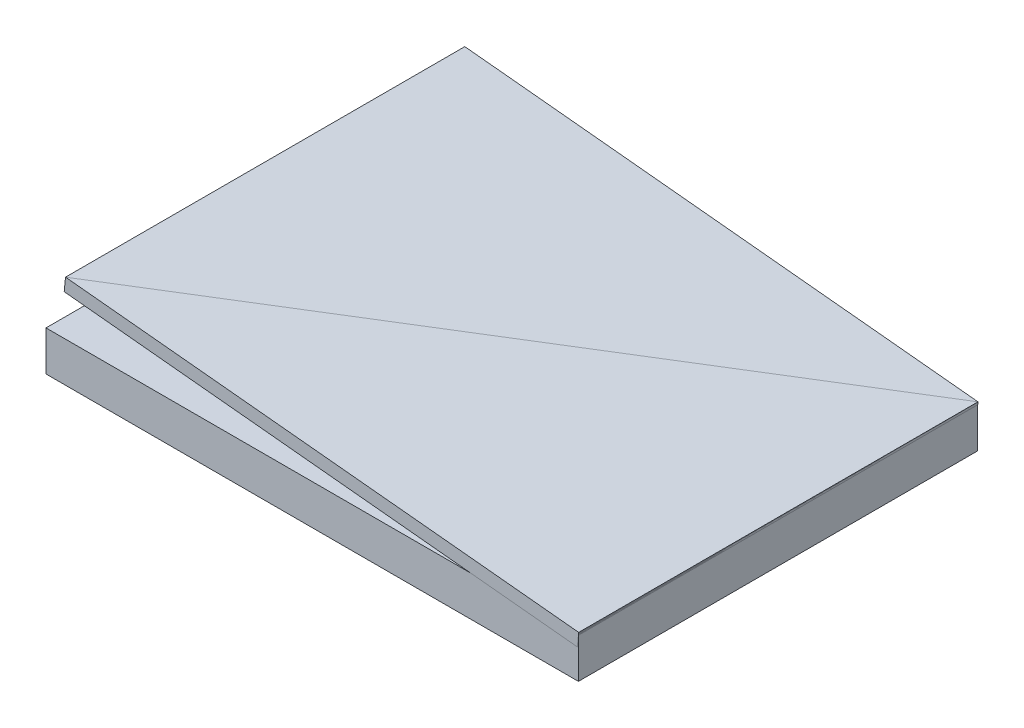
ISO-10303-21;
HEADER;
FILE_DESCRIPTION(('STEP AP214'),'2;1');
FILE_NAME('part.step','',(''),(''),'','','');
FILE_SCHEMA(('AUTOMOTIVE_DESIGN { 1 0 10303 214 1 1 1 1 }'));
ENDSEC;
DATA;
#1=APPLICATION_CONTEXT('core data for automotive mechanical design processes');
#2=APPLICATION_PROTOCOL_DEFINITION('international standard','automotive_design',2000,#1);
#3=PRODUCT_CONTEXT('',#1,'mechanical');
#4=PRODUCT('Part','Part','',(#3));
#5=PRODUCT_RELATED_PRODUCT_CATEGORY('part','',(#4));
#6=PRODUCT_DEFINITION_FORMATION('','',#4);
#7=PRODUCT_DEFINITION_CONTEXT('part definition',#1,'design');
#8=PRODUCT_DEFINITION('design','',#6,#7);
#9=PRODUCT_DEFINITION_SHAPE('','',#8);
#10=(LENGTH_UNIT() NAMED_UNIT(*) SI_UNIT(.MILLI.,.METRE.));
#11=(NAMED_UNIT(*) PLANE_ANGLE_UNIT() SI_UNIT($,.RADIAN.));
#12=(NAMED_UNIT(*) SI_UNIT($,.STERADIAN.) SOLID_ANGLE_UNIT());
#13=UNCERTAINTY_MEASURE_WITH_UNIT(LENGTH_MEASURE(1.E-05),#10,'distance_accuracy_value','');
#14=(GEOMETRIC_REPRESENTATION_CONTEXT(3) GLOBAL_UNCERTAINTY_ASSIGNED_CONTEXT((#13)) GLOBAL_UNIT_ASSIGNED_CONTEXT((#10,
#11,#12)) REPRESENTATION_CONTEXT('',''));
#15=CARTESIAN_POINT('',(0.,0.,0.));
#16=DIRECTION('',(0.,0.,1.));
#17=DIRECTION('',(1.,0.,0.));
#18=AXIS2_PLACEMENT_3D('',#15,#16,#17);
#19=CARTESIAN_POINT('',(-115.126189151026,564.380655557641,150.));
#20=DIRECTION('',(0.,0.,1.));
#21=DIRECTION('',(1.,0.,0.));
#22=AXIS2_PLACEMENT_3D('',#19,#20,#21);
#23=PLANE('',#22);
#24=DIRECTION('',(0.995090127679177,-0.0989729144535993,0.));
#25=VECTOR('',#24,1.);
#26=CARTESIAN_POINT('',(-114.13646000649,574.331556834433,150.));
#27=LINE('',#26,#25);
#28=CARTESIAN_POINT('',(-114.13646000649,574.331556834433,150.));
#29=VERTEX_POINT('',#28);
#30=CARTESIAN_POINT('',(271.409921267733,535.984629304617,150.));
#31=VERTEX_POINT('',#30);
#32=EDGE_CURVE('E114',#29,#31,#27,.T.);
#33=ORIENTED_EDGE('',*,*,#32,.F.);
#34=DIRECTION('',(0.098972914453599,0.995090127679177,0.));
#35=VECTOR('',#34,1.);
#36=CARTESIAN_POINT('',(-115.126189151026,564.380655557641,150.));
#37=LINE('',#36,#35);
#38=CARTESIAN_POINT('',(-115.126189151026,564.380655557641,150.));
#39=VERTEX_POINT('',#38);
#40=EDGE_CURVE('E12',#39,#29,#37,.T.);
#41=ORIENTED_EDGE('',*,*,#40,.F.);
#42=DIRECTION('',(0.995090127679177,-0.0989729144535993,0.));
#43=VECTOR('',#42,1.);
#44=CARTESIAN_POINT('',(-115.126189151026,564.380655557641,150.));
#45=LINE('',#44,#43);
#46=CARTESIAN_POINT('',(270.420192123197,526.033728027825,150.));
#47=VERTEX_POINT('',#46);
#48=EDGE_CURVE('E108',#39,#47,#45,.T.);
#49=ORIENTED_EDGE('',*,*,#48,.T.);
#50=DIRECTION('',(0.098972914453599,0.995090127679177,0.));
#51=VECTOR('',#50,1.);
#52=CARTESIAN_POINT('',(270.420192123197,526.033728027825,150.));
#53=LINE('',#52,#51);
#54=EDGE_CURVE('E53',#47,#31,#53,.T.);
#55=ORIENTED_EDGE('',*,*,#54,.T.);
#56=EDGE_LOOP('',(#33,#41,#49,#55));
#57=FACE_BOUND('',#56,.T.);
#58=ADVANCED_FACE('F50',(#57),#23,.T.);
#59=CARTESIAN_POINT('',(-115.126189151026,564.380655557641,-150.));
#60=DIRECTION('',(-0.995090127679177,0.098972914453599,0.));
#61=DIRECTION('',(-0.098972914453599,-0.995090127679177,0.));
#62=AXIS2_PLACEMENT_3D('',#59,#60,#61);
#63=PLANE('',#62);
#64=DIRECTION('',(0.,0.,1.));
#65=VECTOR('',#64,1.);
#66=CARTESIAN_POINT('',(-114.13646000649,574.331556834433,-150.));
#67=LINE('',#66,#65);
#68=CARTESIAN_POINT('',(-114.13646000649,574.331556834433,-150.));
#69=VERTEX_POINT('',#68);
#70=EDGE_CURVE('E110',#69,#29,#67,.T.);
#71=ORIENTED_EDGE('',*,*,#70,.F.);
#72=DIRECTION('',(0.098972914453599,0.995090127679177,0.));
#73=VECTOR('',#72,1.);
#74=CARTESIAN_POINT('',(-115.126189151026,564.380655557641,-150.));
#75=LINE('',#74,#73);
#76=CARTESIAN_POINT('',(-115.126189151026,564.380655557641,-150.));
#77=VERTEX_POINT('',#76);
#78=EDGE_CURVE('E59',#77,#69,#75,.T.);
#79=ORIENTED_EDGE('',*,*,#78,.F.);
#80=DIRECTION('',(0.,0.,1.));
#81=VECTOR('',#80,1.);
#82=CARTESIAN_POINT('',(-115.126189151026,564.380655557641,-150.));
#83=LINE('',#82,#81);
#84=EDGE_CURVE('E105',#77,#39,#83,.T.);
#85=ORIENTED_EDGE('',*,*,#84,.T.);
#86=ORIENTED_EDGE('',*,*,#40,.T.);
#87=EDGE_LOOP('',(#71,#79,#85,#86));
#88=FACE_BOUND('',#87,.T.);
#89=ADVANCED_FACE('F124',(#88),#63,.T.);
#90=CARTESIAN_POINT('',(270.420192123197,526.033728027825,-150.));
#91=DIRECTION('',(0.,0.,-1.));
#92=DIRECTION('',(-1.,0.,0.));
#93=AXIS2_PLACEMENT_3D('',#90,#91,#92);
#94=PLANE('',#93);
#95=DIRECTION('',(-0.995090127679177,0.0989729144535993,0.));
#96=VECTOR('',#95,1.);
#97=CARTESIAN_POINT('',(271.409921267733,535.984629304617,-150.));
#98=LINE('',#97,#96);
#99=CARTESIAN_POINT('',(271.409921267733,535.984629304617,-150.));
#100=VERTEX_POINT('',#99);
#101=EDGE_CURVE('E100',#100,#69,#98,.T.);
#102=ORIENTED_EDGE('',*,*,#101,.F.);
#103=DIRECTION('',(0.098972914453599,0.995090127679177,0.));
#104=VECTOR('',#103,1.);
#105=CARTESIAN_POINT('',(270.420192123197,526.033728027825,-150.));
#106=LINE('',#105,#104);
#107=CARTESIAN_POINT('',(270.420192123197,526.033728027825,-150.));
#108=VERTEX_POINT('',#107);
#109=EDGE_CURVE('E95',#108,#100,#106,.T.);
#110=ORIENTED_EDGE('',*,*,#109,.F.);
#111=DIRECTION('',(-0.995090127679177,0.0989729144535993,0.));
#112=VECTOR('',#111,1.);
#113=CARTESIAN_POINT('',(270.420192123197,526.033728027825,-150.));
#114=LINE('',#113,#112);
#115=EDGE_CURVE('E98',#108,#77,#114,.T.);
#116=ORIENTED_EDGE('',*,*,#115,.T.);
#117=ORIENTED_EDGE('',*,*,#78,.T.);
#118=EDGE_LOOP('',(#102,#110,#116,#117));
#119=FACE_BOUND('',#118,.T.);
#120=ADVANCED_FACE('F97',(#119),#94,.T.);
#121=CARTESIAN_POINT('',(270.420192123197,526.033728027825,150.));
#122=DIRECTION('',(0.995090127679177,-0.098972914453599,0.));
#123=DIRECTION('',(0.098972914453599,0.995090127679177,0.));
#124=AXIS2_PLACEMENT_3D('',#121,#122,#123);
#125=PLANE('',#124);
#126=DIRECTION('',(0.,0.,-1.));
#127=VECTOR('',#126,1.);
#128=CARTESIAN_POINT('',(271.409921267733,535.984629304617,150.));
#129=LINE('',#128,#127);
#130=EDGE_CURVE('E117',#31,#100,#129,.T.);
#131=ORIENTED_EDGE('',*,*,#130,.F.);
#132=ORIENTED_EDGE('',*,*,#54,.F.);
#133=DIRECTION('',(0.,0.,-1.));
#134=VECTOR('',#133,1.);
#135=CARTESIAN_POINT('',(270.420192123197,526.033728027825,150.));
#136=LINE('',#135,#134);
#137=EDGE_CURVE('E104',#47,#108,#136,.T.);
#138=ORIENTED_EDGE('',*,*,#137,.T.);
#139=ORIENTED_EDGE('',*,*,#109,.T.);
#140=EDGE_LOOP('',(#131,#132,#138,#139));
#141=FACE_BOUND('',#140,.T.);
#142=ADVANCED_FACE('F107',(#141),#125,.T.);
#143=CARTESIAN_POINT('',(54.4564062881762,547.513757530657,0.));
#144=DIRECTION('',(0.0989729144535993,0.995090127679177,0.));
#145=DIRECTION('',(-0.995090127679177,0.0989729144535993,0.));
#146=AXIS2_PLACEMENT_3D('',#143,#144,#145);
#147=PLANE('',#146);
#148=ORIENTED_EDGE('',*,*,#48,.F.);
#149=ORIENTED_EDGE('',*,*,#84,.F.);
#150=ORIENTED_EDGE('',*,*,#115,.F.);
#151=ORIENTED_EDGE('',*,*,#137,.F.);
#152=EDGE_LOOP('',(#148,#149,#150,#151));
#153=FACE_BOUND('',#152,.T.);
#154=ADVANCED_FACE('F103',(#153),#147,.F.);
#155=CARTESIAN_POINT('',(55.4461354327122,557.464658807449,0.));
#156=DIRECTION('',(0.0989729144535993,0.995090127679177,0.));
#157=DIRECTION('',(-0.995090127679177,0.0989729144535993,0.));
#158=AXIS2_PLACEMENT_3D('',#155,#156,#157);
#159=PLANE('',#158);
#160=ORIENTED_EDGE('',*,*,#32,.T.);
#161=ORIENTED_EDGE('',*,*,#130,.T.);
#162=ORIENTED_EDGE('',*,*,#101,.T.);
#163=ORIENTED_EDGE('',*,*,#70,.T.);
#164=EDGE_LOOP('',(#160,#161,#162,#163));
#165=FACE_BOUND('',#164,.T.);
#166=ADVANCED_FACE('F123',(#165),#159,.T.);
#167=CLOSED_SHELL('',(#58,#89,#120,#142,#154,#166));
#168=MANIFOLD_SOLID_BREP('B2',#167);
#169=CARTESIAN_POINT('',(271.211975438825,533.994449049259,150.));
#170=DIRECTION('',(-0.995090127679177,0.0989729144535989,0.));
#171=DIRECTION('',(-0.0989729144535989,-0.995090127679177,0.));
#172=AXIS2_PLACEMENT_3D('',#169,#170,#171);
#173=PLANE('',#172);
#174=DIRECTION('',(0.,0.,-1.));
#175=VECTOR('',#174,1.);
#176=CARTESIAN_POINT('',(271.211975438825,533.994449049259,150.));
#177=LINE('',#176,#175);
#178=CARTESIAN_POINT('',(271.211975438825,533.994449049259,150.));
#179=VERTEX_POINT('',#178);
#180=CARTESIAN_POINT('',(271.211975438825,533.994449049259,-150.));
#181=VERTEX_POINT('',#180);
#182=EDGE_CURVE('E240',#179,#181,#177,.T.);
#183=ORIENTED_EDGE('',*,*,#182,.T.);
#184=DIRECTION('',(0.0989729144535989,0.995090127679177,0.));
#185=VECTOR('',#184,1.);
#186=CARTESIAN_POINT('',(271.211975438825,533.994449049259,-150.));
#187=LINE('',#186,#185);
#188=CARTESIAN_POINT('',(271.409921267733,535.984629304617,-150.));
#189=VERTEX_POINT('',#188);
#190=EDGE_CURVE('E235',#181,#189,#187,.T.);
#191=ORIENTED_EDGE('',*,*,#190,.T.);
#192=DIRECTION('',(0.,0.,-1.));
#193=VECTOR('',#192,1.);
#194=CARTESIAN_POINT('',(271.409921267733,535.984629304617,150.));
#195=LINE('',#194,#193);
#196=CARTESIAN_POINT('',(271.409921267733,535.984629304617,150.));
#197=VERTEX_POINT('',#196);
#198=EDGE_CURVE('E48',#197,#189,#195,.T.);
#199=ORIENTED_EDGE('',*,*,#198,.F.);
#200=DIRECTION('',(0.0989729144535989,0.995090127679177,0.));
#201=VECTOR('',#200,1.);
#202=CARTESIAN_POINT('',(271.211975438825,533.994449049259,150.));
#203=LINE('',#202,#201);
#204=EDGE_CURVE('E246',#179,#197,#203,.T.);
#205=ORIENTED_EDGE('',*,*,#204,.F.);
#206=EDGE_LOOP('',(#183,#191,#199,#205));
#207=FACE_BOUND('',#206,.T.);
#208=ADVANCED_FACE('F183',(#207),#173,.F.);
#209=CARTESIAN_POINT('',(271.409921267733,535.984629304617,150.));
#210=DIRECTION('',(-0.098972914453599,-0.995090127679177,0.));
#211=DIRECTION('',(0.995090127679177,-0.098972914453599,0.));
#212=AXIS2_PLACEMENT_3D('',#209,#210,#211);
#213=PLANE('',#212);
#214=ORIENTED_EDGE('',*,*,#198,.T.);
#215=DIRECTION('',(-0.995090127679177,0.098972914453599,0.));
#216=VECTOR('',#215,1.);
#217=CARTESIAN_POINT('',(271.409921267733,535.984629304617,-150.));
#218=LINE('',#217,#216);
#219=CARTESIAN_POINT('',(-114.13646000649,574.331556834433,-150.));
#220=VERTEX_POINT('',#219);
#221=EDGE_CURVE('E225',#189,#220,#218,.T.);
#222=ORIENTED_EDGE('',*,*,#221,.T.);
#223=DIRECTION('',(0.,0.,-1.));
#224=VECTOR('',#223,1.);
#225=CARTESIAN_POINT('',(-114.13646000649,574.331556834433,150.));
#226=LINE('',#225,#224);
#227=CARTESIAN_POINT('',(-114.13646000649,574.331556834433,150.));
#228=VERTEX_POINT('',#227);
#229=EDGE_CURVE('E190',#228,#220,#226,.T.);
#230=ORIENTED_EDGE('',*,*,#229,.F.);
#231=DIRECTION('',(-0.995090127679177,0.098972914453599,0.));
#232=VECTOR('',#231,1.);
#233=CARTESIAN_POINT('',(271.409921267733,535.984629304617,150.));
#234=LINE('',#233,#232);
#235=EDGE_CURVE('E226',#197,#228,#234,.T.);
#236=ORIENTED_EDGE('',*,*,#235,.F.);
#237=EDGE_LOOP('',(#214,#222,#230,#236));
#238=FACE_BOUND('',#237,.T.);
#239=ADVANCED_FACE('F223',(#238),#213,.F.);
#240=CARTESIAN_POINT('',(-114.334405835397,572.341376579074,150.));
#241=DIRECTION('',(0.995090127679176,-0.0989729144536072,0.));
#242=DIRECTION('',(0.0989729144536072,0.995090127679176,0.));
#243=AXIS2_PLACEMENT_3D('',#240,#241,#242);
#244=PLANE('',#243);
#245=ORIENTED_EDGE('',*,*,#229,.T.);
#246=DIRECTION('',(-0.0989729144536072,-0.995090127679176,0.));
#247=VECTOR('',#246,1.);
#248=CARTESIAN_POINT('',(-114.334405835397,572.341376579074,-150.));
#249=LINE('',#248,#247);
#250=CARTESIAN_POINT('',(-114.334405835397,572.341376579074,-150.));
#251=VERTEX_POINT('',#250);
#252=EDGE_CURVE('E238',#220,#251,#249,.T.);
#253=ORIENTED_EDGE('',*,*,#252,.T.);
#254=DIRECTION('',(0.,0.,-1.));
#255=VECTOR('',#254,1.);
#256=CARTESIAN_POINT('',(-114.334405835397,572.341376579074,150.));
#257=LINE('',#256,#255);
#258=CARTESIAN_POINT('',(-114.334405835397,572.341376579074,150.));
#259=VERTEX_POINT('',#258);
#260=EDGE_CURVE('E252',#259,#251,#257,.T.);
#261=ORIENTED_EDGE('',*,*,#260,.F.);
#262=DIRECTION('',(-0.0989729144536072,-0.995090127679176,0.));
#263=VECTOR('',#262,1.);
#264=CARTESIAN_POINT('',(-114.334405835397,572.341376579074,150.));
#265=LINE('',#264,#263);
#266=EDGE_CURVE('E202',#228,#259,#265,.T.);
#267=ORIENTED_EDGE('',*,*,#266,.F.);
#268=EDGE_LOOP('',(#245,#253,#261,#267));
#269=FACE_BOUND('',#268,.T.);
#270=ADVANCED_FACE('F254',(#269),#244,.F.);
#271=CARTESIAN_POINT('',(271.211975438825,533.994449049259,150.));
#272=DIRECTION('',(0.0989729144535987,0.995090127679177,0.));
#273=DIRECTION('',(-0.995090127679177,0.0989729144535987,0.));
#274=AXIS2_PLACEMENT_3D('',#271,#272,#273);
#275=PLANE('',#274);
#276=ORIENTED_EDGE('',*,*,#260,.T.);
#277=DIRECTION('',(0.995090127679177,-0.0989729144535987,0.));
#278=VECTOR('',#277,1.);
#279=CARTESIAN_POINT('',(271.211975438825,533.994449049259,-150.));
#280=LINE('',#279,#278);
#281=EDGE_CURVE('E244',#251,#181,#280,.T.);
#282=ORIENTED_EDGE('',*,*,#281,.T.);
#283=ORIENTED_EDGE('',*,*,#182,.F.);
#284=DIRECTION('',(0.995090127679177,-0.0989729144535987,0.));
#285=VECTOR('',#284,1.);
#286=CARTESIAN_POINT('',(271.211975438825,533.994449049259,150.));
#287=LINE('',#286,#285);
#288=EDGE_CURVE('E197',#259,#179,#287,.T.);
#289=ORIENTED_EDGE('',*,*,#288,.F.);
#290=EDGE_LOOP('',(#276,#282,#283,#289));
#291=FACE_BOUND('',#290,.T.);
#292=ADVANCED_FACE('F256',(#291),#275,.F.);
#293=CARTESIAN_POINT('',(0.,0.,150.));
#294=DIRECTION('',(0.,0.,1.));
#295=DIRECTION('',(1.,0.,0.));
#296=AXIS2_PLACEMENT_3D('',#293,#294,#295);
#297=PLANE('',#296);
#298=ORIENTED_EDGE('',*,*,#204,.T.);
#299=ORIENTED_EDGE('',*,*,#235,.T.);
#300=ORIENTED_EDGE('',*,*,#266,.T.);
#301=ORIENTED_EDGE('',*,*,#288,.T.);
#302=EDGE_LOOP('',(#298,#299,#300,#301));
#303=FACE_BOUND('',#302,.T.);
#304=ADVANCED_FACE('F257',(#303),#297,.T.);
#305=CARTESIAN_POINT('',(0.,0.,-150.));
#306=DIRECTION('',(0.,0.,1.));
#307=DIRECTION('',(1.,0.,0.));
#308=AXIS2_PLACEMENT_3D('',#305,#306,#307);
#309=PLANE('',#308);
#310=ORIENTED_EDGE('',*,*,#190,.F.);
#311=ORIENTED_EDGE('',*,*,#281,.F.);
#312=ORIENTED_EDGE('',*,*,#252,.F.);
#313=ORIENTED_EDGE('',*,*,#221,.F.);
#314=EDGE_LOOP('',(#310,#311,#312,#313));
#315=FACE_BOUND('',#314,.T.);
#316=ADVANCED_FACE('F233',(#315),#309,.F.);
#317=CLOSED_SHELL('',(#208,#239,#270,#292,#304,#316));
#318=MANIFOLD_SOLID_BREP('B6',#317);
#319=CARTESIAN_POINT('',(-128.788024561175,533.994449049259,150.));
#320=DIRECTION('',(1.,0.,0.));
#321=DIRECTION('',(0.,0.,-1.));
#322=AXIS2_PLACEMENT_3D('',#319,#320,#321);
#323=PLANE('',#322);
#324=DIRECTION('',(0.,-1.,0.));
#325=VECTOR('',#324,1.);
#326=CARTESIAN_POINT('',(-128.788024561175,533.994449049259,-150.));
#327=LINE('',#326,#325);
#328=CARTESIAN_POINT('',(-128.788024561175,533.994449049259,-150.));
#329=VERTEX_POINT('',#328);
#330=CARTESIAN_POINT('',(-128.788024561175,503.994449049259,-150.));
#331=VERTEX_POINT('',#330);
#332=EDGE_CURVE('E370',#329,#331,#327,.T.);
#333=ORIENTED_EDGE('',*,*,#332,.T.);
#334=DIRECTION('',(0.,0.,-1.));
#335=VECTOR('',#334,1.);
#336=CARTESIAN_POINT('',(-128.788024561175,503.994449049259,150.));
#337=LINE('',#336,#335);
#338=CARTESIAN_POINT('',(-128.788024561175,503.994449049259,150.));
#339=VERTEX_POINT('',#338);
#340=EDGE_CURVE('E181',#339,#331,#337,.T.);
#341=ORIENTED_EDGE('',*,*,#340,.F.);
#342=DIRECTION('',(0.,-1.,0.));
#343=VECTOR('',#342,1.);
#344=CARTESIAN_POINT('',(-128.788024561175,533.994449049259,150.));
#345=LINE('',#344,#343);
#346=CARTESIAN_POINT('',(-128.788024561175,533.994449049259,150.));
#347=VERTEX_POINT('',#346);
#348=EDGE_CURVE('E358',#347,#339,#345,.T.);
#349=ORIENTED_EDGE('',*,*,#348,.F.);
#350=DIRECTION('',(0.,0.,-1.));
#351=VECTOR('',#350,1.);
#352=CARTESIAN_POINT('',(-128.788024561175,533.994449049259,150.));
#353=LINE('',#352,#351);
#354=EDGE_CURVE('E366',#347,#329,#353,.T.);
#355=ORIENTED_EDGE('',*,*,#354,.T.);
#356=EDGE_LOOP('',(#333,#341,#349,#355));
#357=FACE_BOUND('',#356,.T.);
#358=ADVANCED_FACE('F307',(#357),#323,.F.);
#359=CARTESIAN_POINT('',(-128.788024561175,503.994449049259,150.));
#360=DIRECTION('',(0.,1.,0.));
#361=DIRECTION('',(0.,0.,1.));
#362=AXIS2_PLACEMENT_3D('',#359,#360,#361);
#363=PLANE('',#362);
#364=DIRECTION('',(1.,0.,0.));
#365=VECTOR('',#364,1.);
#366=CARTESIAN_POINT('',(-128.788024561175,503.994449049259,-150.));
#367=LINE('',#366,#365);
#368=CARTESIAN_POINT('',(271.211975438825,503.994449049259,-150.));
#369=VERTEX_POINT('',#368);
#370=EDGE_CURVE('E362',#331,#369,#367,.T.);
#371=ORIENTED_EDGE('',*,*,#370,.T.);
#372=DIRECTION('',(0.,0.,-1.));
#373=VECTOR('',#372,1.);
#374=CARTESIAN_POINT('',(271.211975438825,503.994449049259,150.));
#375=LINE('',#374,#373);
#376=CARTESIAN_POINT('',(271.211975438825,503.994449049259,150.));
#377=VERTEX_POINT('',#376);
#378=EDGE_CURVE('E315',#377,#369,#375,.T.);
#379=ORIENTED_EDGE('',*,*,#378,.F.);
#380=DIRECTION('',(1.,0.,0.));
#381=VECTOR('',#380,1.);
#382=CARTESIAN_POINT('',(-128.788024561175,503.994449049259,150.));
#383=LINE('',#382,#381);
#384=EDGE_CURVE('E353',#339,#377,#383,.T.);
#385=ORIENTED_EDGE('',*,*,#384,.F.);
#386=ORIENTED_EDGE('',*,*,#340,.T.);
#387=EDGE_LOOP('',(#371,#379,#385,#386));
#388=FACE_BOUND('',#387,.T.);
#389=ADVANCED_FACE('F361',(#388),#363,.F.);
#390=CARTESIAN_POINT('',(271.211975438825,533.994449049259,150.));
#391=DIRECTION('',(-1.,0.,0.));
#392=DIRECTION('',(0.,0.,1.));
#393=AXIS2_PLACEMENT_3D('',#390,#391,#392);
#394=PLANE('',#393);
#395=DIRECTION('',(0.,1.,0.));
#396=VECTOR('',#395,1.);
#397=CARTESIAN_POINT('',(271.211975438825,533.994449049259,-150.));
#398=LINE('',#397,#396);
#399=CARTESIAN_POINT('',(271.211975438825,533.994449049259,-150.));
#400=VERTEX_POINT('',#399);
#401=EDGE_CURVE('E340',#369,#400,#398,.T.);
#402=ORIENTED_EDGE('',*,*,#401,.T.);
#403=DIRECTION('',(0.,0.,-1.));
#404=VECTOR('',#403,1.);
#405=CARTESIAN_POINT('',(271.211975438825,533.994449049259,150.));
#406=LINE('',#405,#404);
#407=CARTESIAN_POINT('',(271.211975438825,533.994449049259,150.));
#408=VERTEX_POINT('',#407);
#409=EDGE_CURVE('E363',#408,#400,#406,.T.);
#410=ORIENTED_EDGE('',*,*,#409,.F.);
#411=DIRECTION('',(0.,1.,0.));
#412=VECTOR('',#411,1.);
#413=CARTESIAN_POINT('',(271.211975438825,533.994449049259,150.));
#414=LINE('',#413,#412);
#415=EDGE_CURVE('E356',#377,#408,#414,.T.);
#416=ORIENTED_EDGE('',*,*,#415,.F.);
#417=ORIENTED_EDGE('',*,*,#378,.T.);
#418=EDGE_LOOP('',(#402,#410,#416,#417));
#419=FACE_BOUND('',#418,.T.);
#420=ADVANCED_FACE('F364',(#419),#394,.F.);
#421=CARTESIAN_POINT('',(-128.788024561175,533.994449049259,150.));
#422=DIRECTION('',(0.,-1.,0.));
#423=DIRECTION('',(0.,0.,-1.));
#424=AXIS2_PLACEMENT_3D('',#421,#422,#423);
#425=PLANE('',#424);
#426=DIRECTION('',(-1.,0.,0.));
#427=VECTOR('',#426,1.);
#428=CARTESIAN_POINT('',(-128.788024561175,533.994449049259,-150.));
#429=LINE('',#428,#427);
#430=EDGE_CURVE('E346',#400,#329,#429,.T.);
#431=ORIENTED_EDGE('',*,*,#430,.T.);
#432=ORIENTED_EDGE('',*,*,#354,.F.);
#433=DIRECTION('',(-1.,0.,0.));
#434=VECTOR('',#433,1.);
#435=CARTESIAN_POINT('',(-128.788024561175,533.994449049259,150.));
#436=LINE('',#435,#434);
#437=EDGE_CURVE('E323',#408,#347,#436,.T.);
#438=ORIENTED_EDGE('',*,*,#437,.F.);
#439=ORIENTED_EDGE('',*,*,#409,.T.);
#440=EDGE_LOOP('',(#431,#432,#438,#439));
#441=FACE_BOUND('',#440,.T.);
#442=ADVANCED_FACE('F377',(#441),#425,.F.);
#443=CARTESIAN_POINT('',(0.,0.,150.));
#444=DIRECTION('',(0.,0.,1.));
#445=DIRECTION('',(1.,0.,0.));
#446=AXIS2_PLACEMENT_3D('',#443,#444,#445);
#447=PLANE('',#446);
#448=ORIENTED_EDGE('',*,*,#348,.T.);
#449=ORIENTED_EDGE('',*,*,#384,.T.);
#450=ORIENTED_EDGE('',*,*,#415,.T.);
#451=ORIENTED_EDGE('',*,*,#437,.T.);
#452=EDGE_LOOP('',(#448,#449,#450,#451));
#453=FACE_BOUND('',#452,.T.);
#454=ADVANCED_FACE('F354',(#453),#447,.T.);
#455=CARTESIAN_POINT('',(0.,0.,-150.));
#456=DIRECTION('',(0.,0.,1.));
#457=DIRECTION('',(1.,0.,0.));
#458=AXIS2_PLACEMENT_3D('',#455,#456,#457);
#459=PLANE('',#458);
#460=ORIENTED_EDGE('',*,*,#332,.F.);
#461=ORIENTED_EDGE('',*,*,#430,.F.);
#462=ORIENTED_EDGE('',*,*,#401,.F.);
#463=ORIENTED_EDGE('',*,*,#370,.F.);
#464=EDGE_LOOP('',(#460,#461,#462,#463));
#465=FACE_BOUND('',#464,.T.);
#466=ADVANCED_FACE('F380',(#465),#459,.F.);
#467=CLOSED_SHELL('',(#358,#389,#420,#442,#454,#466));
#468=MANIFOLD_SOLID_BREP('B42_NOT_SHOWN',#467);
#469=ADVANCED_BREP_SHAPE_REPRESENTATION('',(#18,#168,#318,#468),#14);
#470=SHAPE_DEFINITION_REPRESENTATION(#9,#469);
ENDSEC;
END-ISO-10303-21;
